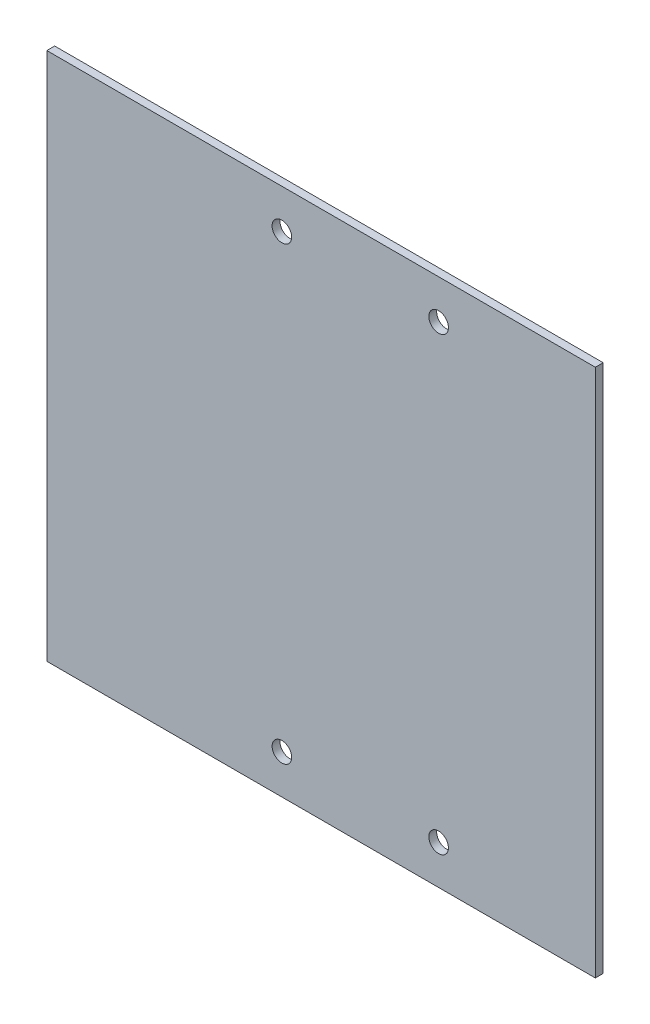
ISO-10303-21;
HEADER;
FILE_DESCRIPTION(('STEP AP214'),'2;1');
FILE_NAME('part.step','',(''),(''),'','','');
FILE_SCHEMA(('AUTOMOTIVE_DESIGN { 1 0 10303 214 1 1 1 1 }'));
ENDSEC;
DATA;
#1=APPLICATION_CONTEXT('core data for automotive mechanical design processes');
#2=APPLICATION_PROTOCOL_DEFINITION('international standard','automotive_design',2000,#1);
#3=PRODUCT_CONTEXT('',#1,'mechanical');
#4=PRODUCT('Part','Part','',(#3));
#5=PRODUCT_RELATED_PRODUCT_CATEGORY('part','',(#4));
#6=PRODUCT_DEFINITION_FORMATION('','',#4);
#7=PRODUCT_DEFINITION_CONTEXT('part definition',#1,'design');
#8=PRODUCT_DEFINITION('design','',#6,#7);
#9=PRODUCT_DEFINITION_SHAPE('','',#8);
#10=(LENGTH_UNIT() NAMED_UNIT(*) SI_UNIT(.MILLI.,.METRE.));
#11=(NAMED_UNIT(*) PLANE_ANGLE_UNIT() SI_UNIT($,.RADIAN.));
#12=(NAMED_UNIT(*) SI_UNIT($,.STERADIAN.) SOLID_ANGLE_UNIT());
#13=UNCERTAINTY_MEASURE_WITH_UNIT(LENGTH_MEASURE(1.E-05),#10,'distance_accuracy_value','');
#14=(GEOMETRIC_REPRESENTATION_CONTEXT(3) GLOBAL_UNCERTAINTY_ASSIGNED_CONTEXT((#13)) GLOBAL_UNIT_ASSIGNED_CONTEXT((#10,
#11,#12)) REPRESENTATION_CONTEXT('',''));
#15=CARTESIAN_POINT('',(0.,0.,0.));
#16=DIRECTION('',(0.,0.,1.));
#17=DIRECTION('',(1.,0.,0.));
#18=AXIS2_PLACEMENT_3D('',#15,#16,#17);
#19=CARTESIAN_POINT('',(0.,0.,2.));
#20=DIRECTION('',(0.,0.,-1.));
#21=DIRECTION('',(-1.,0.,0.));
#22=AXIS2_PLACEMENT_3D('',#19,#20,#21);
#23=PLANE('',#22);
#24=DIRECTION('',(0.,-1.,0.));
#25=VECTOR('',#24,1.);
#26=CARTESIAN_POINT('',(0.,0.,2.));
#27=LINE('',#26,#25);
#28=CARTESIAN_POINT('',(0.,135.,2.));
#29=VERTEX_POINT('',#28);
#30=CARTESIAN_POINT('',(0.,0.,2.));
#31=VERTEX_POINT('',#30);
#32=EDGE_CURVE('E92',#29,#31,#27,.T.);
#33=ORIENTED_EDGE('',*,*,#32,.T.);
#34=DIRECTION('',(1.,0.,0.));
#35=VECTOR('',#34,1.);
#36=CARTESIAN_POINT('',(0.,0.,2.));
#37=LINE('',#36,#35);
#38=CARTESIAN_POINT('',(140.,0.,2.));
#39=VERTEX_POINT('',#38);
#40=EDGE_CURVE('E87',#31,#39,#37,.T.);
#41=ORIENTED_EDGE('',*,*,#40,.T.);
#42=DIRECTION('',(0.,1.,0.));
#43=VECTOR('',#42,1.);
#44=CARTESIAN_POINT('',(140.,0.,2.));
#45=LINE('',#44,#43);
#46=CARTESIAN_POINT('',(140.,135.,2.));
#47=VERTEX_POINT('',#46);
#48=EDGE_CURVE('E90',#39,#47,#45,.T.);
#49=ORIENTED_EDGE('',*,*,#48,.T.);
#50=DIRECTION('',(-1.,0.,0.));
#51=VECTOR('',#50,1.);
#52=CARTESIAN_POINT('',(0.,135.,2.));
#53=LINE('',#52,#51);
#54=EDGE_CURVE('E57',#47,#29,#53,.T.);
#55=ORIENTED_EDGE('',*,*,#54,.T.);
#56=EDGE_LOOP('',(#33,#41,#49,#55));
#57=FACE_BOUND('',#56,.T.);
#58=CARTESIAN_POINT('',(60.,125.,2.));
#59=DIRECTION('',(0.,0.,1.));
#60=DIRECTION('',(1.,0.,0.));
#61=AXIS2_PLACEMENT_3D('',#58,#59,#60);
#62=CIRCLE('',#61,2.5);
#63=CARTESIAN_POINT('',(62.5,125.,2.));
#64=VERTEX_POINT('',#63);
#65=EDGE_CURVE('E112',#64,#64,#62,.T.);
#66=ORIENTED_EDGE('',*,*,#65,.F.);
#67=EDGE_LOOP('',(#66));
#68=FACE_BOUND('',#67,.T.);
#69=CARTESIAN_POINT('',(100.,125.,2.));
#70=DIRECTION('',(0.,0.,1.));
#71=DIRECTION('',(1.,0.,0.));
#72=AXIS2_PLACEMENT_3D('',#69,#70,#71);
#73=CIRCLE('',#72,2.5);
#74=CARTESIAN_POINT('',(102.5,125.,2.));
#75=VERTEX_POINT('',#74);
#76=EDGE_CURVE('E134',#75,#75,#73,.T.);
#77=ORIENTED_EDGE('',*,*,#76,.F.);
#78=EDGE_LOOP('',(#77));
#79=FACE_BOUND('',#78,.T.);
#80=CARTESIAN_POINT('',(60.,10.,2.));
#81=DIRECTION('',(0.,0.,1.));
#82=DIRECTION('',(1.,0.,0.));
#83=AXIS2_PLACEMENT_3D('',#80,#81,#82);
#84=CIRCLE('',#83,2.5);
#85=CARTESIAN_POINT('',(62.5,10.,2.));
#86=VERTEX_POINT('',#85);
#87=EDGE_CURVE('E142',#86,#86,#84,.T.);
#88=ORIENTED_EDGE('',*,*,#87,.F.);
#89=EDGE_LOOP('',(#88));
#90=FACE_BOUND('',#89,.T.);
#91=CARTESIAN_POINT('',(100.,10.,2.));
#92=DIRECTION('',(0.,0.,1.));
#93=DIRECTION('',(1.,0.,0.));
#94=AXIS2_PLACEMENT_3D('',#91,#92,#93);
#95=CIRCLE('',#94,2.49999999999999);
#96=CARTESIAN_POINT('',(102.5,10.,2.));
#97=VERTEX_POINT('',#96);
#98=EDGE_CURVE('E150',#97,#97,#95,.T.);
#99=ORIENTED_EDGE('',*,*,#98,.F.);
#100=EDGE_LOOP('',(#99));
#101=FACE_BOUND('',#100,.T.);
#102=ADVANCED_FACE('F39',(#57,#68,#79,#90,#101),#23,.F.);
#103=CARTESIAN_POINT('',(0.,0.,0.));
#104=DIRECTION('',(0.,0.,-1.));
#105=DIRECTION('',(-1.,0.,0.));
#106=AXIS2_PLACEMENT_3D('',#103,#104,#105);
#107=PLANE('',#106);
#108=CARTESIAN_POINT('',(60.,10.,0.));
#109=DIRECTION('',(0.,0.,1.));
#110=DIRECTION('',(1.,0.,0.));
#111=AXIS2_PLACEMENT_3D('',#108,#109,#110);
#112=CIRCLE('',#111,2.5);
#113=CARTESIAN_POINT('',(62.5,10.,0.));
#114=VERTEX_POINT('',#113);
#115=EDGE_CURVE('E146',#114,#114,#112,.T.);
#116=ORIENTED_EDGE('',*,*,#115,.T.);
#117=EDGE_LOOP('',(#116));
#118=FACE_BOUND('',#117,.T.);
#119=CARTESIAN_POINT('',(60.,125.,0.));
#120=DIRECTION('',(0.,0.,1.));
#121=DIRECTION('',(1.,0.,0.));
#122=AXIS2_PLACEMENT_3D('',#119,#120,#121);
#123=CIRCLE('',#122,2.5);
#124=CARTESIAN_POINT('',(62.5,125.,0.));
#125=VERTEX_POINT('',#124);
#126=EDGE_CURVE('E130',#125,#125,#123,.T.);
#127=ORIENTED_EDGE('',*,*,#126,.T.);
#128=EDGE_LOOP('',(#127));
#129=FACE_BOUND('',#128,.T.);
#130=DIRECTION('',(0.,-1.,0.));
#131=VECTOR('',#130,1.);
#132=CARTESIAN_POINT('',(0.,0.,0.));
#133=LINE('',#132,#131);
#134=CARTESIAN_POINT('',(0.,135.,0.));
#135=VERTEX_POINT('',#134);
#136=CARTESIAN_POINT('',(0.,0.,0.));
#137=VERTEX_POINT('',#136);
#138=EDGE_CURVE('E108',#135,#137,#133,.T.);
#139=ORIENTED_EDGE('',*,*,#138,.F.);
#140=DIRECTION('',(-1.,0.,0.));
#141=VECTOR('',#140,1.);
#142=CARTESIAN_POINT('',(0.,135.,0.));
#143=LINE('',#142,#141);
#144=CARTESIAN_POINT('',(140.,135.,0.));
#145=VERTEX_POINT('',#144);
#146=EDGE_CURVE('E80',#145,#135,#143,.T.);
#147=ORIENTED_EDGE('',*,*,#146,.F.);
#148=DIRECTION('',(0.,1.,0.));
#149=VECTOR('',#148,1.);
#150=CARTESIAN_POINT('',(140.,0.,0.));
#151=LINE('',#150,#149);
#152=CARTESIAN_POINT('',(140.,0.,0.));
#153=VERTEX_POINT('',#152);
#154=EDGE_CURVE('E74',#153,#145,#151,.T.);
#155=ORIENTED_EDGE('',*,*,#154,.F.);
#156=DIRECTION('',(1.,0.,0.));
#157=VECTOR('',#156,1.);
#158=CARTESIAN_POINT('',(0.,0.,0.));
#159=LINE('',#158,#157);
#160=EDGE_CURVE('E97',#137,#153,#159,.T.);
#161=ORIENTED_EDGE('',*,*,#160,.F.);
#162=EDGE_LOOP('',(#139,#147,#155,#161));
#163=FACE_BOUND('',#162,.T.);
#164=CARTESIAN_POINT('',(100.,125.,0.));
#165=DIRECTION('',(0.,0.,1.));
#166=DIRECTION('',(1.,0.,0.));
#167=AXIS2_PLACEMENT_3D('',#164,#165,#166);
#168=CIRCLE('',#167,2.5);
#169=CARTESIAN_POINT('',(102.5,125.,0.));
#170=VERTEX_POINT('',#169);
#171=EDGE_CURVE('E138',#170,#170,#168,.T.);
#172=ORIENTED_EDGE('',*,*,#171,.T.);
#173=EDGE_LOOP('',(#172));
#174=FACE_BOUND('',#173,.T.);
#175=CARTESIAN_POINT('',(100.,10.,0.));
#176=DIRECTION('',(0.,0.,1.));
#177=DIRECTION('',(1.,0.,0.));
#178=AXIS2_PLACEMENT_3D('',#175,#176,#177);
#179=CIRCLE('',#178,2.49999999999999);
#180=CARTESIAN_POINT('',(102.5,10.,0.));
#181=VERTEX_POINT('',#180);
#182=EDGE_CURVE('E154',#181,#181,#179,.T.);
#183=ORIENTED_EDGE('',*,*,#182,.T.);
#184=EDGE_LOOP('',(#183));
#185=FACE_BOUND('',#184,.T.);
#186=ADVANCED_FACE('F125',(#118,#129,#163,#174,#185),#107,.T.);
#187=CARTESIAN_POINT('',(0.,0.,2.));
#188=DIRECTION('',(1.,0.,0.));
#189=DIRECTION('',(0.,0.,-1.));
#190=AXIS2_PLACEMENT_3D('',#187,#188,#189);
#191=PLANE('',#190);
#192=ORIENTED_EDGE('',*,*,#138,.T.);
#193=DIRECTION('',(0.,0.,-1.));
#194=VECTOR('',#193,1.);
#195=CARTESIAN_POINT('',(0.,0.,2.));
#196=LINE('',#195,#194);
#197=EDGE_CURVE('E11',#31,#137,#196,.T.);
#198=ORIENTED_EDGE('',*,*,#197,.F.);
#199=ORIENTED_EDGE('',*,*,#32,.F.);
#200=DIRECTION('',(0.,0.,-1.));
#201=VECTOR('',#200,1.);
#202=CARTESIAN_POINT('',(0.,135.,2.));
#203=LINE('',#202,#201);
#204=EDGE_CURVE('E104',#29,#135,#203,.T.);
#205=ORIENTED_EDGE('',*,*,#204,.T.);
#206=EDGE_LOOP('',(#192,#198,#199,#205));
#207=FACE_BOUND('',#206,.T.);
#208=ADVANCED_FACE('F41',(#207),#191,.F.);
#209=CARTESIAN_POINT('',(0.,0.,2.));
#210=DIRECTION('',(0.,1.,0.));
#211=DIRECTION('',(0.,0.,1.));
#212=AXIS2_PLACEMENT_3D('',#209,#210,#211);
#213=PLANE('',#212);
#214=ORIENTED_EDGE('',*,*,#160,.T.);
#215=DIRECTION('',(0.,0.,-1.));
#216=VECTOR('',#215,1.);
#217=CARTESIAN_POINT('',(140.,0.,2.));
#218=LINE('',#217,#216);
#219=EDGE_CURVE('E49',#39,#153,#218,.T.);
#220=ORIENTED_EDGE('',*,*,#219,.F.);
#221=ORIENTED_EDGE('',*,*,#40,.F.);
#222=ORIENTED_EDGE('',*,*,#197,.T.);
#223=EDGE_LOOP('',(#214,#220,#221,#222));
#224=FACE_BOUND('',#223,.T.);
#225=ADVANCED_FACE('F96',(#224),#213,.F.);
#226=CARTESIAN_POINT('',(140.,0.,2.));
#227=DIRECTION('',(-1.,0.,0.));
#228=DIRECTION('',(0.,0.,1.));
#229=AXIS2_PLACEMENT_3D('',#226,#227,#228);
#230=PLANE('',#229);
#231=ORIENTED_EDGE('',*,*,#154,.T.);
#232=DIRECTION('',(0.,0.,-1.));
#233=VECTOR('',#232,1.);
#234=CARTESIAN_POINT('',(140.,135.,2.));
#235=LINE('',#234,#233);
#236=EDGE_CURVE('E99',#47,#145,#235,.T.);
#237=ORIENTED_EDGE('',*,*,#236,.F.);
#238=ORIENTED_EDGE('',*,*,#48,.F.);
#239=ORIENTED_EDGE('',*,*,#219,.T.);
#240=EDGE_LOOP('',(#231,#237,#238,#239));
#241=FACE_BOUND('',#240,.T.);
#242=ADVANCED_FACE('F100',(#241),#230,.F.);
#243=CARTESIAN_POINT('',(0.,135.,2.));
#244=DIRECTION('',(0.,-1.,0.));
#245=DIRECTION('',(0.,0.,-1.));
#246=AXIS2_PLACEMENT_3D('',#243,#244,#245);
#247=PLANE('',#246);
#248=ORIENTED_EDGE('',*,*,#146,.T.);
#249=ORIENTED_EDGE('',*,*,#204,.F.);
#250=ORIENTED_EDGE('',*,*,#54,.F.);
#251=ORIENTED_EDGE('',*,*,#236,.T.);
#252=EDGE_LOOP('',(#248,#249,#250,#251));
#253=FACE_BOUND('',#252,.T.);
#254=ADVANCED_FACE('F122',(#253),#247,.F.);
#255=CARTESIAN_POINT('',(60.,125.,2.));
#256=DIRECTION('',(0.,0.,-1.));
#257=DIRECTION('',(-1.,0.,0.));
#258=AXIS2_PLACEMENT_3D('',#255,#256,#257);
#259=CYLINDRICAL_SURFACE('',#258,2.5);
#260=ORIENTED_EDGE('',*,*,#65,.T.);
#261=EDGE_LOOP('',(#260));
#262=FACE_BOUND('',#261,.T.);
#263=ORIENTED_EDGE('',*,*,#126,.F.);
#264=EDGE_LOOP('',(#263));
#265=FACE_BOUND('',#264,.T.);
#266=ADVANCED_FACE('F173',(#262,#265),#259,.F.);
#267=CARTESIAN_POINT('',(100.,125.,2.));
#268=DIRECTION('',(0.,0.,-1.));
#269=DIRECTION('',(-1.,0.,0.));
#270=AXIS2_PLACEMENT_3D('',#267,#268,#269);
#271=CYLINDRICAL_SURFACE('',#270,2.5);
#272=ORIENTED_EDGE('',*,*,#76,.T.);
#273=EDGE_LOOP('',(#272));
#274=FACE_BOUND('',#273,.T.);
#275=ORIENTED_EDGE('',*,*,#171,.F.);
#276=EDGE_LOOP('',(#275));
#277=FACE_BOUND('',#276,.T.);
#278=ADVANCED_FACE('F219',(#274,#277),#271,.F.);
#279=CARTESIAN_POINT('',(60.,10.,2.));
#280=DIRECTION('',(0.,0.,-1.));
#281=DIRECTION('',(-1.,0.,0.));
#282=AXIS2_PLACEMENT_3D('',#279,#280,#281);
#283=CYLINDRICAL_SURFACE('',#282,2.5);
#284=ORIENTED_EDGE('',*,*,#87,.T.);
#285=EDGE_LOOP('',(#284));
#286=FACE_BOUND('',#285,.T.);
#287=ORIENTED_EDGE('',*,*,#115,.F.);
#288=EDGE_LOOP('',(#287));
#289=FACE_BOUND('',#288,.T.);
#290=ADVANCED_FACE('F227',(#286,#289),#283,.F.);
#291=CARTESIAN_POINT('',(100.,10.,2.));
#292=DIRECTION('',(0.,0.,-1.));
#293=DIRECTION('',(-1.,0.,0.));
#294=AXIS2_PLACEMENT_3D('',#291,#292,#293);
#295=CYLINDRICAL_SURFACE('',#294,2.49999999999999);
#296=ORIENTED_EDGE('',*,*,#98,.T.);
#297=EDGE_LOOP('',(#296));
#298=FACE_BOUND('',#297,.T.);
#299=ORIENTED_EDGE('',*,*,#182,.F.);
#300=EDGE_LOOP('',(#299));
#301=FACE_BOUND('',#300,.T.);
#302=ADVANCED_FACE('F162',(#298,#301),#295,.F.);
#303=CLOSED_SHELL('',(#102,#186,#208,#225,#242,#254,#266,#278,#290,#302));
#304=MANIFOLD_SOLID_BREP('B2',#303);
#305=ADVANCED_BREP_SHAPE_REPRESENTATION('',(#18,#304),#14);
#306=SHAPE_DEFINITION_REPRESENTATION(#9,#305);
ENDSEC;
END-ISO-10303-21;
